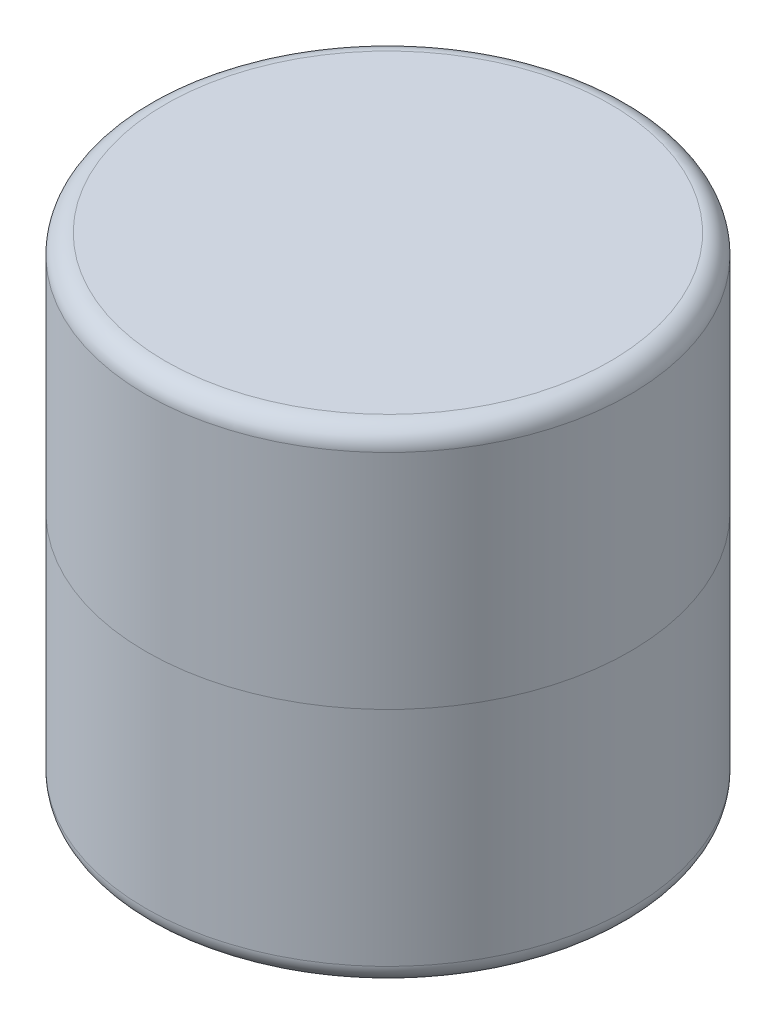
ISO-10303-21;
HEADER;
FILE_DESCRIPTION(('STEP AP214'),'2;1');
FILE_NAME('part.step','',(''),(''),'','','');
FILE_SCHEMA(('AUTOMOTIVE_DESIGN { 1 0 10303 214 1 1 1 1 }'));
ENDSEC;
DATA;
#1=APPLICATION_CONTEXT('core data for automotive mechanical design processes');
#2=APPLICATION_PROTOCOL_DEFINITION('international standard','automotive_design',2000,#1);
#3=PRODUCT_CONTEXT('',#1,'mechanical');
#4=PRODUCT('Part','Part','',(#3));
#5=PRODUCT_RELATED_PRODUCT_CATEGORY('part','',(#4));
#6=PRODUCT_DEFINITION_FORMATION('','',#4);
#7=PRODUCT_DEFINITION_CONTEXT('part definition',#1,'design');
#8=PRODUCT_DEFINITION('design','',#6,#7);
#9=PRODUCT_DEFINITION_SHAPE('','',#8);
#10=(LENGTH_UNIT() NAMED_UNIT(*) SI_UNIT(.MILLI.,.METRE.));
#11=(NAMED_UNIT(*) PLANE_ANGLE_UNIT() SI_UNIT($,.RADIAN.));
#12=(NAMED_UNIT(*) SI_UNIT($,.STERADIAN.) SOLID_ANGLE_UNIT());
#13=UNCERTAINTY_MEASURE_WITH_UNIT(LENGTH_MEASURE(1.E-05),#10,'distance_accuracy_value','');
#14=(GEOMETRIC_REPRESENTATION_CONTEXT(3) GLOBAL_UNCERTAINTY_ASSIGNED_CONTEXT((#13)) GLOBAL_UNIT_ASSIGNED_CONTEXT((#10,
#11,#12)) REPRESENTATION_CONTEXT('',''));
#15=CARTESIAN_POINT('',(0.,0.,0.));
#16=DIRECTION('',(0.,0.,1.));
#17=DIRECTION('',(1.,0.,0.));
#18=AXIS2_PLACEMENT_3D('',#15,#16,#17);
#19=CARTESIAN_POINT('',(0.,2.5,0.));
#20=DIRECTION('',(0.,1.,0.));
#21=DIRECTION('',(0.,0.,-1.));
#22=AXIS2_PLACEMENT_3D('',#19,#20,#21);
#23=CYLINDRICAL_SURFACE('',#22,2.5);
#24=CARTESIAN_POINT('',(0.,4.8,0.));
#25=DIRECTION('',(0.,1.,0.));
#26=DIRECTION('',(0.,0.,1.));
#27=AXIS2_PLACEMENT_3D('',#24,#25,#26);
#28=CIRCLE('',#27,2.5);
#29=CARTESIAN_POINT('',(0.,4.8,2.5));
#30=VERTEX_POINT('',#29);
#31=EDGE_CURVE('E51',#30,#30,#28,.T.);
#32=ORIENTED_EDGE('',*,*,#31,.F.);
#33=EDGE_LOOP('',(#32));
#34=FACE_BOUND('',#33,.T.);
#35=CARTESIAN_POINT('',(0.,2.5,0.));
#36=DIRECTION('',(0.,1.,0.));
#37=DIRECTION('',(0.,0.,1.));
#38=AXIS2_PLACEMENT_3D('',#35,#36,#37);
#39=CIRCLE('',#38,2.5);
#40=CARTESIAN_POINT('',(0.,2.5,2.5));
#41=VERTEX_POINT('',#40);
#42=EDGE_CURVE('E55',#41,#41,#39,.T.);
#43=ORIENTED_EDGE('',*,*,#42,.T.);
#44=EDGE_LOOP('',(#43));
#45=FACE_BOUND('',#44,.T.);
#46=ADVANCED_FACE('F44',(#34,#45),#23,.T.);
#47=CARTESIAN_POINT('',(0.,2.5,0.));
#48=DIRECTION('',(0.,-1.,0.));
#49=DIRECTION('',(0.,0.,1.));
#50=AXIS2_PLACEMENT_3D('',#47,#48,#49);
#51=PLANE('',#50);
#52=ORIENTED_EDGE('',*,*,#42,.F.);
#53=EDGE_LOOP('',(#52));
#54=FACE_BOUND('',#53,.T.);
#55=ADVANCED_FACE('F63',(#54),#51,.T.);
#56=CARTESIAN_POINT('',(0.,5.,0.));
#57=DIRECTION('',(0.,-1.,0.));
#58=DIRECTION('',(0.,0.,1.));
#59=AXIS2_PLACEMENT_3D('',#56,#57,#58);
#60=PLANE('',#59);
#61=CARTESIAN_POINT('',(0.,5.,0.));
#62=DIRECTION('',(0.,1.,0.));
#63=DIRECTION('',(0.,0.,1.));
#64=AXIS2_PLACEMENT_3D('',#61,#62,#63);
#65=CIRCLE('',#64,2.3);
#66=CARTESIAN_POINT('',(0.,5.,2.3));
#67=VERTEX_POINT('',#66);
#68=EDGE_CURVE('E11',#67,#67,#65,.F.);
#69=ORIENTED_EDGE('',*,*,#68,.F.);
#70=EDGE_LOOP('',(#69));
#71=FACE_BOUND('',#70,.T.);
#72=ADVANCED_FACE('F65',(#71),#60,.F.);
#73=CARTESIAN_POINT('',(0.,4.8,0.));
#74=DIRECTION('',(0.,-1.,0.));
#75=DIRECTION('',(0.,0.,1.));
#76=AXIS2_PLACEMENT_3D('',#73,#74,#75);
#77=TOROIDAL_SURFACE('',#76,2.3,0.2);
#78=ORIENTED_EDGE('',*,*,#68,.T.);
#79=EDGE_LOOP('',(#78));
#80=FACE_BOUND('',#79,.T.);
#81=ORIENTED_EDGE('',*,*,#31,.T.);
#82=EDGE_LOOP('',(#81));
#83=FACE_BOUND('',#82,.T.);
#84=ADVANCED_FACE('F46',(#80,#83),#77,.T.);
#85=CLOSED_SHELL('',(#46,#55,#72,#84));
#86=MANIFOLD_SOLID_BREP('B2',#85);
#87=CARTESIAN_POINT('',(0.,2.5,0.));
#88=DIRECTION('',(0.,-1.,0.));
#89=DIRECTION('',(0.,0.,-1.));
#90=AXIS2_PLACEMENT_3D('',#87,#88,#89);
#91=CYLINDRICAL_SURFACE('',#90,2.5);
#92=CARTESIAN_POINT('',(0.,0.2,0.));
#93=DIRECTION('',(0.,1.,0.));
#94=DIRECTION('',(0.,0.,1.));
#95=AXIS2_PLACEMENT_3D('',#92,#93,#94);
#96=CIRCLE('',#95,2.5);
#97=CARTESIAN_POINT('',(0.,0.2,2.5));
#98=VERTEX_POINT('',#97);
#99=EDGE_CURVE('E106',#98,#98,#96,.T.);
#100=ORIENTED_EDGE('',*,*,#99,.T.);
#101=EDGE_LOOP('',(#100));
#102=FACE_BOUND('',#101,.T.);
#103=CARTESIAN_POINT('',(0.,2.5,0.));
#104=DIRECTION('',(0.,1.,0.));
#105=DIRECTION('',(0.,0.,1.));
#106=AXIS2_PLACEMENT_3D('',#103,#104,#105);
#107=CIRCLE('',#106,2.5);
#108=CARTESIAN_POINT('',(0.,2.5,2.5));
#109=VERTEX_POINT('',#108);
#110=EDGE_CURVE('E110',#109,#109,#107,.T.);
#111=ORIENTED_EDGE('',*,*,#110,.F.);
#112=EDGE_LOOP('',(#111));
#113=FACE_BOUND('',#112,.T.);
#114=ADVANCED_FACE('F99',(#102,#113),#91,.T.);
#115=CARTESIAN_POINT('',(0.,2.5,0.));
#116=DIRECTION('',(0.,1.,0.));
#117=DIRECTION('',(0.,0.,1.));
#118=AXIS2_PLACEMENT_3D('',#115,#116,#117);
#119=PLANE('',#118);
#120=ORIENTED_EDGE('',*,*,#110,.T.);
#121=EDGE_LOOP('',(#120));
#122=FACE_BOUND('',#121,.T.);
#123=ADVANCED_FACE('F117',(#122),#119,.T.);
#124=CARTESIAN_POINT('',(0.,0.,0.));
#125=DIRECTION('',(0.,1.,0.));
#126=DIRECTION('',(0.,0.,1.));
#127=AXIS2_PLACEMENT_3D('',#124,#125,#126);
#128=PLANE('',#127);
#129=CARTESIAN_POINT('',(0.,0.,0.));
#130=DIRECTION('',(0.,1.,0.));
#131=DIRECTION('',(0.,0.,1.));
#132=AXIS2_PLACEMENT_3D('',#129,#130,#131);
#133=CIRCLE('',#132,2.3);
#134=CARTESIAN_POINT('',(0.,0.,2.3));
#135=VERTEX_POINT('',#134);
#136=EDGE_CURVE('E43',#135,#135,#133,.F.);
#137=ORIENTED_EDGE('',*,*,#136,.T.);
#138=EDGE_LOOP('',(#137));
#139=FACE_BOUND('',#138,.T.);
#140=ADVANCED_FACE('F123',(#139),#128,.F.);
#141=CARTESIAN_POINT('',(0.,0.2,0.));
#142=DIRECTION('',(0.,1.,0.));
#143=DIRECTION('',(0.,0.,1.));
#144=AXIS2_PLACEMENT_3D('',#141,#142,#143);
#145=TOROIDAL_SURFACE('',#144,2.3,0.2);
#146=ORIENTED_EDGE('',*,*,#136,.F.);
#147=EDGE_LOOP('',(#146));
#148=FACE_BOUND('',#147,.T.);
#149=ORIENTED_EDGE('',*,*,#99,.F.);
#150=EDGE_LOOP('',(#149));
#151=FACE_BOUND('',#150,.T.);
#152=ADVANCED_FACE('F101',(#148,#151),#145,.T.);
#153=CLOSED_SHELL('',(#114,#123,#140,#152));
#154=MANIFOLD_SOLID_BREP('B6',#153);
#155=ADVANCED_BREP_SHAPE_REPRESENTATION('',(#18,#86,#154),#14);
#156=SHAPE_DEFINITION_REPRESENTATION(#9,#155);
ENDSEC;
END-ISO-10303-21;
